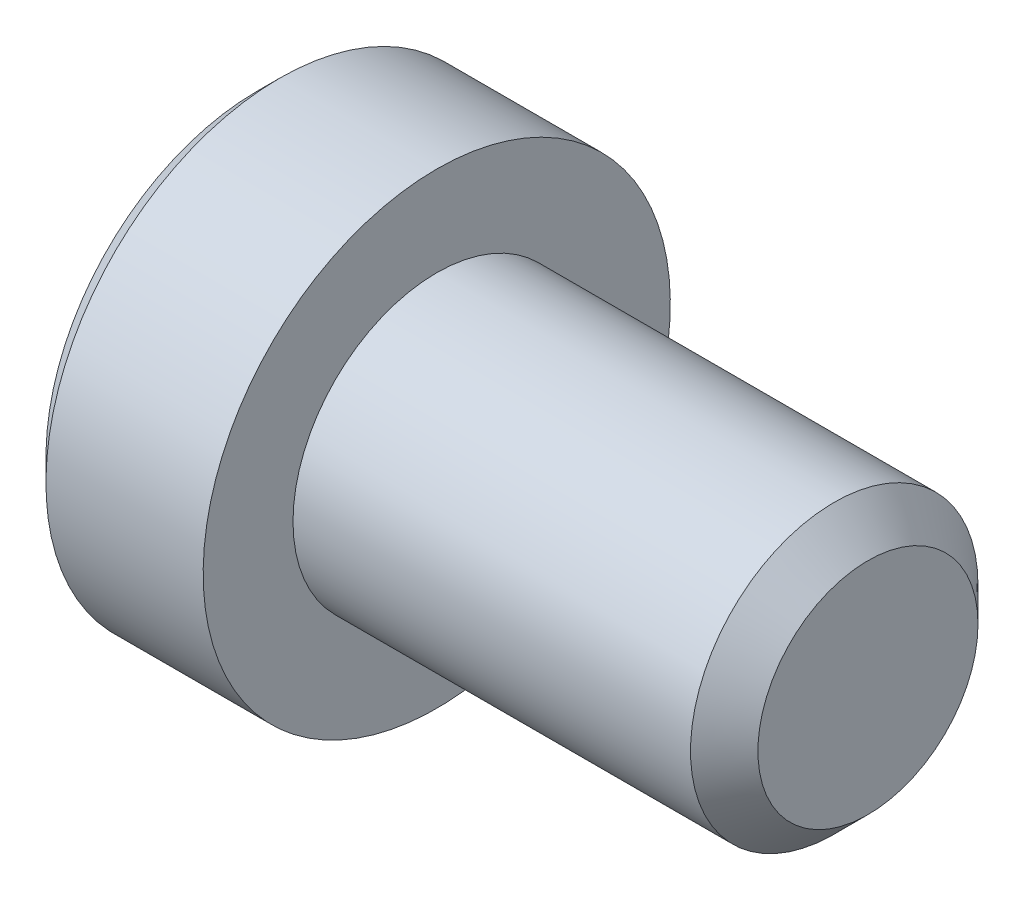
ISO-10303-21;
HEADER;
FILE_DESCRIPTION(('STEP AP214'),'2;1');
FILE_NAME('part.step','',(''),(''),'','','');
FILE_SCHEMA(('AUTOMOTIVE_DESIGN { 1 0 10303 214 1 1 1 1 }'));
ENDSEC;
DATA;
#1=APPLICATION_CONTEXT('core data for automotive mechanical design processes');
#2=APPLICATION_PROTOCOL_DEFINITION('international standard','automotive_design',2000,#1);
#3=PRODUCT_CONTEXT('',#1,'mechanical');
#4=PRODUCT('Part','Part','',(#3));
#5=PRODUCT_RELATED_PRODUCT_CATEGORY('part','',(#4));
#6=PRODUCT_DEFINITION_FORMATION('','',#4);
#7=PRODUCT_DEFINITION_CONTEXT('part definition',#1,'design');
#8=PRODUCT_DEFINITION('design','',#6,#7);
#9=PRODUCT_DEFINITION_SHAPE('','',#8);
#10=(LENGTH_UNIT() NAMED_UNIT(*) SI_UNIT(.MILLI.,.METRE.));
#11=(NAMED_UNIT(*) PLANE_ANGLE_UNIT() SI_UNIT($,.RADIAN.));
#12=(NAMED_UNIT(*) SI_UNIT($,.STERADIAN.) SOLID_ANGLE_UNIT());
#13=UNCERTAINTY_MEASURE_WITH_UNIT(LENGTH_MEASURE(1.E-05),#10,'distance_accuracy_value','');
#14=(GEOMETRIC_REPRESENTATION_CONTEXT(3) GLOBAL_UNCERTAINTY_ASSIGNED_CONTEXT((#13)) GLOBAL_UNIT_ASSIGNED_CONTEXT((#10,
#11,#12)) REPRESENTATION_CONTEXT('',''));
#15=CARTESIAN_POINT('',(0.,0.,0.));
#16=DIRECTION('',(0.,0.,1.));
#17=DIRECTION('',(1.,0.,0.));
#18=AXIS2_PLACEMENT_3D('',#15,#16,#17);
#19=CARTESIAN_POINT('',(-11.,5.87499999999999,0.));
#20=DIRECTION('',(-1.,0.,0.));
#21=DIRECTION('',(0.,-1.,0.));
#22=AXIS2_PLACEMENT_3D('',#19,#20,#21);
#23=PLANE('',#22);
#24=CARTESIAN_POINT('',(-11.,0.,0.));
#25=DIRECTION('',(-1.,0.,0.));
#26=DIRECTION('',(0.,-1.,0.));
#27=AXIS2_PLACEMENT_3D('',#24,#25,#26);
#28=CIRCLE('',#27,2.88675134594808);
#29=CARTESIAN_POINT('',(-11.,-2.88675134594805,-1.2793585635329E-13));
#30=VERTEX_POINT('',#29);
#31=CARTESIAN_POINT('',(-11.,-1.44337567297413,2.49999999999989));
#32=VERTEX_POINT('',#31);
#33=EDGE_CURVE('E142',#30,#32,#28,.T.);
#34=ORIENTED_EDGE('',*,*,#33,.F.);
#35=CARTESIAN_POINT('',(-11.,-1.44337567297406,-2.5));
#36=VERTEX_POINT('',#35);
#37=EDGE_CURVE('E141',#36,#30,#28,.T.);
#38=ORIENTED_EDGE('',*,*,#37,.F.);
#39=CARTESIAN_POINT('',(-11.,1.443375672974,-2.5));
#40=VERTEX_POINT('',#39);
#41=EDGE_CURVE('E111',#40,#36,#28,.T.);
#42=ORIENTED_EDGE('',*,*,#41,.F.);
#43=CARTESIAN_POINT('',(-11.,2.88675134594811,0.));
#44=VERTEX_POINT('',#43);
#45=EDGE_CURVE('E104',#44,#40,#28,.T.);
#46=ORIENTED_EDGE('',*,*,#45,.F.);
#47=CARTESIAN_POINT('',(-11.,1.443375672974,2.5));
#48=VERTEX_POINT('',#47);
#49=EDGE_CURVE('E65',#48,#44,#28,.T.);
#50=ORIENTED_EDGE('',*,*,#49,.F.);
#51=EDGE_CURVE('E72',#32,#48,#28,.T.);
#52=ORIENTED_EDGE('',*,*,#51,.F.);
#53=EDGE_LOOP('',(#34,#38,#42,#46,#50,#52));
#54=FACE_BOUND('',#53,.T.);
#55=CARTESIAN_POINT('',(-11.,0.,0.));
#56=DIRECTION('',(1.,0.,0.));
#57=DIRECTION('',(0.,1.,0.));
#58=AXIS2_PLACEMENT_3D('',#55,#56,#57);
#59=CIRCLE('',#58,5.87499999999999);
#60=CARTESIAN_POINT('',(-11.,5.87499999999999,0.));
#61=VERTEX_POINT('',#60);
#62=EDGE_CURVE('E231',#61,#61,#59,.T.);
#63=ORIENTED_EDGE('',*,*,#62,.F.);
#64=EDGE_LOOP('',(#63));
#65=FACE_BOUND('',#64,.T.);
#66=ADVANCED_FACE('F45',(#54,#65),#23,.T.);
#67=CARTESIAN_POINT('',(-6.,0.,0.));
#68=DIRECTION('',(1.,0.,0.));
#69=DIRECTION('',(0.,0.,-1.));
#70=AXIS2_PLACEMENT_3D('',#67,#68,#69);
#71=CYLINDRICAL_SURFACE('',#70,4.);
#72=CARTESIAN_POINT('',(5.0625,0.,0.));
#73=DIRECTION('',(1.,0.,0.));
#74=DIRECTION('',(0.,0.,-1.));
#75=AXIS2_PLACEMENT_3D('',#72,#73,#74);
#76=CIRCLE('',#75,4.);
#77=CARTESIAN_POINT('',(5.0625,0.,-4.));
#78=VERTEX_POINT('',#77);
#79=EDGE_CURVE('E59',#78,#78,#76,.F.);
#80=ORIENTED_EDGE('',*,*,#79,.T.);
#81=EDGE_LOOP('',(#80));
#82=FACE_BOUND('',#81,.T.);
#83=CARTESIAN_POINT('',(-6.,0.,0.));
#84=DIRECTION('',(1.,0.,0.));
#85=DIRECTION('',(0.,1.,0.));
#86=AXIS2_PLACEMENT_3D('',#83,#84,#85);
#87=CIRCLE('',#86,4.);
#88=CARTESIAN_POINT('',(-6.,3.99999999999999,0.));
#89=VERTEX_POINT('',#88);
#90=EDGE_CURVE('E224',#89,#89,#87,.F.);
#91=ORIENTED_EDGE('',*,*,#90,.F.);
#92=EDGE_LOOP('',(#91));
#93=FACE_BOUND('',#92,.T.);
#94=ADVANCED_FACE('F204',(#82,#93),#71,.T.);
#95=CARTESIAN_POINT('',(6.,0.,0.));
#96=DIRECTION('',(1.,0.,0.));
#97=DIRECTION('',(0.,0.,-1.));
#98=AXIS2_PLACEMENT_3D('',#95,#96,#97);
#99=PLANE('',#98);
#100=CARTESIAN_POINT('',(6.,0.,0.));
#101=DIRECTION('',(1.,0.,0.));
#102=DIRECTION('',(0.,0.,-1.));
#103=AXIS2_PLACEMENT_3D('',#100,#101,#102);
#104=CIRCLE('',#103,3.0625);
#105=CARTESIAN_POINT('',(6.,0.,-3.0625));
#106=VERTEX_POINT('',#105);
#107=EDGE_CURVE('E225',#106,#106,#104,.T.);
#108=ORIENTED_EDGE('',*,*,#107,.T.);
#109=EDGE_LOOP('',(#108));
#110=FACE_BOUND('',#109,.T.);
#111=ADVANCED_FACE('F212',(#110),#99,.T.);
#112=CARTESIAN_POINT('',(6.,0.,0.));
#113=DIRECTION('',(-1.,0.,0.));
#114=DIRECTION('',(0.,0.,1.));
#115=AXIS2_PLACEMENT_3D('',#112,#113,#114);
#116=CONICAL_SURFACE('',#115,3.0625,0.785398163397446);
#117=ORIENTED_EDGE('',*,*,#79,.F.);
#118=EDGE_LOOP('',(#117));
#119=FACE_BOUND('',#118,.T.);
#120=ORIENTED_EDGE('',*,*,#107,.F.);
#121=EDGE_LOOP('',(#120));
#122=FACE_BOUND('',#121,.T.);
#123=ADVANCED_FACE('F47',(#119,#122),#116,.T.);
#124=CARTESIAN_POINT('',(-6.,0.,0.));
#125=DIRECTION('',(1.,0.,0.));
#126=DIRECTION('',(0.,1.,0.));
#127=AXIS2_PLACEMENT_3D('',#124,#125,#126);
#128=CYLINDRICAL_SURFACE('',#127,6.5);
#129=CARTESIAN_POINT('',(-10.375,0.,0.));
#130=DIRECTION('',(1.,0.,0.));
#131=DIRECTION('',(0.,1.,0.));
#132=AXIS2_PLACEMENT_3D('',#129,#130,#131);
#133=CIRCLE('',#132,6.5);
#134=CARTESIAN_POINT('',(-10.375,6.5,0.));
#135=VERTEX_POINT('',#134);
#136=EDGE_CURVE('E226',#135,#135,#133,.T.);
#137=ORIENTED_EDGE('',*,*,#136,.T.);
#138=EDGE_LOOP('',(#137));
#139=FACE_BOUND('',#138,.T.);
#140=CARTESIAN_POINT('',(-6.00000000000001,0.,0.));
#141=DIRECTION('',(1.,0.,0.));
#142=DIRECTION('',(0.,1.,0.));
#143=AXIS2_PLACEMENT_3D('',#140,#141,#142);
#144=CIRCLE('',#143,6.5);
#145=CARTESIAN_POINT('',(-6.,6.5,0.));
#146=VERTEX_POINT('',#145);
#147=EDGE_CURVE('E236',#146,#146,#144,.T.);
#148=ORIENTED_EDGE('',*,*,#147,.F.);
#149=EDGE_LOOP('',(#148));
#150=FACE_BOUND('',#149,.T.);
#151=ADVANCED_FACE('F207',(#139,#150),#128,.T.);
#152=CARTESIAN_POINT('',(-10.375,0.,0.));
#153=DIRECTION('',(1.,0.,0.));
#154=DIRECTION('',(0.,1.,0.));
#155=AXIS2_PLACEMENT_3D('',#152,#153,#154);
#156=CONICAL_SURFACE('',#155,6.5,0.78539816339745);
#157=ORIENTED_EDGE('',*,*,#62,.T.);
#158=EDGE_LOOP('',(#157));
#159=FACE_BOUND('',#158,.T.);
#160=ORIENTED_EDGE('',*,*,#136,.F.);
#161=EDGE_LOOP('',(#160));
#162=FACE_BOUND('',#161,.T.);
#163=ADVANCED_FACE('F200',(#159,#162),#156,.T.);
#164=CARTESIAN_POINT('',(-6.,6.5,0.));
#165=DIRECTION('',(1.,0.,0.));
#166=DIRECTION('',(0.,1.,0.));
#167=AXIS2_PLACEMENT_3D('',#164,#165,#166);
#168=PLANE('',#167);
#169=ORIENTED_EDGE('',*,*,#90,.T.);
#170=EDGE_LOOP('',(#169));
#171=FACE_BOUND('',#170,.T.);
#172=ORIENTED_EDGE('',*,*,#147,.T.);
#173=EDGE_LOOP('',(#172));
#174=FACE_BOUND('',#173,.T.);
#175=ADVANCED_FACE('F164',(#171,#174),#168,.T.);
#176=CARTESIAN_POINT('',(-11.,0.,0.));
#177=DIRECTION('',(-1.,0.,0.));
#178=DIRECTION('',(0.,-1.,0.));
#179=AXIS2_PLACEMENT_3D('',#176,#177,#178);
#180=CONICAL_SURFACE('',#179,2.88675134594808,0.78539816339745);
#181=CARTESIAN_POINT('',(-11.9259641941009,-2.87868021658036,-2.5));
#182=CARTESIAN_POINT('',(-11.8730547697036,-2.80858751797061,-2.5));
#183=CARTESIAN_POINT('',(-11.8206567850984,-2.73810237423985,-2.5));
#184=CARTESIAN_POINT('',(-11.7171126837829,-2.59619238944627,-2.5));
#185=CARTESIAN_POINT('',(-11.6659668846335,-2.5247673169311,-2.5));
#186=CARTESIAN_POINT('',(-11.5647924982128,-2.38030019453244,-2.5));
#187=CARTESIAN_POINT('',(-11.5147756380036,-2.30724990391714,-2.5));
#188=CARTESIAN_POINT('',(-11.4166088441105,-2.15990937427124,-2.5));
#189=CARTESIAN_POINT('',(-11.3684587785286,-2.08561922337519,-2.5));
#190=CARTESIAN_POINT('',(-11.2717465596101,-1.93130274897281,-2.5));
#191=CARTESIAN_POINT('',(-11.2233189326825,-1.85119168522269,-2.5));
#192=CARTESIAN_POINT('',(-11.1296640598242,-1.68912282648628,-2.5));
#193=CARTESIAN_POINT('',(-11.0844363918026,-1.60716527694819,-2.5));
#194=CARTESIAN_POINT('',(-10.9981353747535,-1.4413766864921,-2.5));
#195=CARTESIAN_POINT('',(-10.9570503727365,-1.35755175941127,-2.5));
#196=CARTESIAN_POINT('',(-10.8799618661584,-1.1876157777155,-2.5));
#197=CARTESIAN_POINT('',(-10.8439560607765,-1.10150577935216,-2.5));
#198=CARTESIAN_POINT('',(-10.7809497443197,-0.933895283828147,-2.5));
#199=CARTESIAN_POINT('',(-10.7534577201783,-0.852581486760235,-2.5));
#200=CARTESIAN_POINT('',(-10.7049971144518,-0.687996185179675,-2.5));
#201=CARTESIAN_POINT('',(-10.684028982272,-0.604724546223788,-2.5));
#202=CARTESIAN_POINT('',(-10.6500599950409,-0.438105786660685,-2.5));
#203=CARTESIAN_POINT('',(-10.6369226334678,-0.354786957546946,-2.5));
#204=CARTESIAN_POINT('',(-10.6188701944141,-0.18725863845756,-2.5));
#205=CARTESIAN_POINT('',(-10.6139537035387,-0.103049304090214,-2.5));
#206=CARTESIAN_POINT('',(-10.6127080743668,0.0623819456391823,-2.5));
#207=CARTESIAN_POINT('',(-10.6160745516983,0.143601667517911,-2.5));
#208=CARTESIAN_POINT('',(-10.6305375923521,0.305344840293769,-2.5));
#209=CARTESIAN_POINT('',(-10.6416349066155,0.385868222782068,-2.5));
#210=CARTESIAN_POINT('',(-10.6711420785295,0.546999992215542,-2.5));
#211=CARTESIAN_POINT('',(-10.6896763767655,0.62758525788701,-2.5));
#212=CARTESIAN_POINT('',(-10.7330723319292,0.786991930695549,-2.5));
#213=CARTESIAN_POINT('',(-10.7579334594228,0.865813484821298,-2.5));
#214=CARTESIAN_POINT('',(-10.8455589110989,1.11399280185233,-2.5));
#215=CARTESIAN_POINT('',(-10.9183033352911,1.27984027488856,-2.5));
#216=CARTESIAN_POINT('',(-11.039542345017,1.52253018606747,-2.5));
#217=CARTESIAN_POINT('',(-11.0820714509333,1.60256472858069,-2.5));
#218=CARTESIAN_POINT('',(-11.1703965238313,1.76081489226358,-2.5));
#219=CARTESIAN_POINT('',(-11.216191902132,1.83903083784683,-2.5));
#220=CARTESIAN_POINT('',(-11.3080446783387,1.99000684544533,-2.5));
#221=CARTESIAN_POINT('',(-11.3539756350132,2.06284471965809,-2.5));
#222=CARTESIAN_POINT('',(-11.4477702449325,2.20727164667526,-2.5));
#223=CARTESIAN_POINT('',(-11.4956340445682,2.27886060429821,-2.5));
#224=CARTESIAN_POINT('',(-11.5925522358003,2.42037078473924,-2.5));
#225=CARTESIAN_POINT('',(-11.6415937977771,2.49030083096474,-2.5));
#226=CARTESIAN_POINT('',(-11.7409738346083,2.62920524911317,-2.5));
#227=CARTESIAN_POINT('',(-11.7913119491048,2.69817987855685,-2.5));
#228=CARTESIAN_POINT('',(-11.8421802970587,2.7667546328176,-2.5));
#229=B_SPLINE_CURVE_WITH_KNOTS('',3,(#181,#182,#183,#184,#185,#186,#187,#188,#189,#190,#191,
#192,#193,#194,#195,#196,#197,#198,#199,#200,#201,#202,#203,#204,#205,#206,#207,#208,#209,#210,
#211,#212,#213,#214,#215,#216,#217,#218,#219,#220,#221,#222,#223,#224,#225,#226,#227,#228),
.UNSPECIFIED.,.F.,.F.,(4,2,2,2,2,2,2,2,2,2,2,2,2,2,2,2,2,2,2,2,2,2,2,4),(0.,0.263465915021264,
0.52699796842355,0.79257194343078,1.05812712004023,1.33890112574003,1.61963802660794,
1.89956181259617,2.17935838614975,2.43663887722772,2.69393708742519,2.94660788207624,
3.19923523116723,3.44271854515947,3.68622551339971,3.93398926884441,4.18173229803094,
4.72334004843318,4.99521600373498,5.26704308198529,5.52534341645066,5.7836633510567,
6.03988492160255,6.29603603155376),.UNSPECIFIED.);
#230=EDGE_CURVE('E13',#36,#40,#229,.T.);
#231=ORIENTED_EDGE('',*,*,#230,.T.);
#232=ORIENTED_EDGE('',*,*,#41,.T.);
#233=EDGE_LOOP('',(#231,#232));
#234=FACE_BOUND('',#233,.T.);
#235=ADVANCED_FACE('F116',(#234),#180,.F.);
#236=CARTESIAN_POINT('',(-11.0001154769818,-2.88686681600197,0.000200000000000391));
#237=CARTESIAN_POINT('',(-10.9505407053548,-2.83725032818751,-0.085738277787765));
#238=CARTESIAN_POINT('',(-10.9038774813626,-2.7868041812811,-0.173113567275754));
#239=CARTESIAN_POINT('',(-10.8184381400384,-2.6839389026696,-0.351281456165591));
#240=CARTESIAN_POINT('',(-10.7797095624061,-2.6315099876986,-0.442091000681078));
#241=CARTESIAN_POINT('',(-10.7133667038978,-2.52578957716233,-0.625204123126926));
#242=CARTESIAN_POINT('',(-10.6855856685309,-2.47252500720903,-0.717461064529346));
#243=CARTESIAN_POINT('',(-10.6427831759107,-2.3648232334321,-0.904006008776294));
#244=CARTESIAN_POINT('',(-10.6277297666714,-2.31038931995912,-0.998288312566292));
#245=CARTESIAN_POINT('',(-10.6141477222096,-2.21657570605386,-1.16077825829186));
#246=CARTESIAN_POINT('',(-10.6121370992409,-2.17731721011877,-1.22877596788016));
#247=CARTESIAN_POINT('',(-10.6155241171876,-2.09886438835669,-1.36466024116923));
#248=CARTESIAN_POINT('',(-10.6209243552999,-2.05967008984861,-1.43254675755225));
#249=CARTESIAN_POINT('',(-10.6388257884025,-1.98165157555714,-1.56767878823612));
#250=CARTESIAN_POINT('',(-10.6513349270466,-1.94282782326096,-1.63492349975357));
#251=CARTESIAN_POINT('',(-10.6827675019558,-1.86585167424615,-1.76825010081821));
#252=CARTESIAN_POINT('',(-10.7016904464969,-1.82769922629677,-1.83433207909967));
#253=CARTESIAN_POINT('',(-10.7578673614083,-1.72997445583857,-2.00359634669128));
#254=CARTESIAN_POINT('',(-10.7993558315963,-1.6710080703923,-2.1057291222229));
#255=CARTESIAN_POINT('',(-10.8693940467232,-1.58430317001562,-2.25590641494051));
#256=CARTESIAN_POINT('',(-10.8940022521161,-1.55573003305807,-2.30539653988261));
#257=CARTESIAN_POINT('',(-10.9454618867153,-1.49911303110425,-2.40346006383885));
#258=CARTESIAN_POINT('',(-10.9723119387794,-1.47106885396706,-2.45203400349693));
#259=CARTESIAN_POINT('',(-11.0001154769818,-1.44326020292023,-2.5002));
#260=B_SPLINE_CURVE_WITH_KNOTS('',3,(#236,#237,#238,#239,#240,#241,#242,#243,#244,#245,#246,
#247,#248,#249,#250,#251,#252,#253,#254,#255,#256,#257,#258,#259),.UNSPECIFIED.,.F.,.F.,(4,2,2,
2,2,2,2,2,2,2,2,4),(0.,0.333012085133927,0.667964518301403,0.997597032043309,1.32639954393846,
1.5616942414717,1.79707142102084,2.03271213522172,2.26833478775652,2.64260240809534,
2.82922877818864,3.01574133749025),.UNSPECIFIED.);
#261=EDGE_CURVE('E144',#30,#36,#260,.T.);
#262=ORIENTED_EDGE('',*,*,#261,.T.);
#263=ORIENTED_EDGE('',*,*,#37,.T.);
#264=EDGE_LOOP('',(#262,#263));
#265=FACE_BOUND('',#264,.T.);
#266=ADVANCED_FACE('F163',(#265),#180,.F.);
#267=CARTESIAN_POINT('',(-11.0001154769818,-1.44326020292023,2.5002));
#268=CARTESIAN_POINT('',(-10.9505407053548,-1.49287669073469,2.41426172221224));
#269=CARTESIAN_POINT('',(-10.9038774813626,-1.5433228376411,2.32688643272425));
#270=CARTESIAN_POINT('',(-10.8184381400384,-1.64618811625259,2.14871854383441));
#271=CARTESIAN_POINT('',(-10.7797095624061,-1.69861703122359,2.05790899931893));
#272=CARTESIAN_POINT('',(-10.7133667038978,-1.80433744175985,1.87479587687308));
#273=CARTESIAN_POINT('',(-10.6855856685309,-1.85760201171315,1.78253893547066));
#274=CARTESIAN_POINT('',(-10.6427831759107,-1.96530378549009,1.59599399122372));
#275=CARTESIAN_POINT('',(-10.6277297666714,-2.01973769896306,1.50171168743372));
#276=CARTESIAN_POINT('',(-10.6141477222096,-2.11355131286832,1.33922174170816));
#277=CARTESIAN_POINT('',(-10.6121370992409,-2.15280980880341,1.27122403211986));
#278=CARTESIAN_POINT('',(-10.6155241171876,-2.23126263056549,1.13533975883079));
#279=CARTESIAN_POINT('',(-10.6209243552999,-2.27045692907357,1.06745324244777));
#280=CARTESIAN_POINT('',(-10.6388257884026,-2.34847544336504,0.9323212117639));
#281=CARTESIAN_POINT('',(-10.6513349270466,-2.38729919566122,0.865076500246445));
#282=CARTESIAN_POINT('',(-10.6827675019558,-2.46427534467603,0.731749899181805));
#283=CARTESIAN_POINT('',(-10.7016904464969,-2.50242779262541,0.665667920900347));
#284=CARTESIAN_POINT('',(-10.7578673614083,-2.60015256308361,0.496403653308739));
#285=CARTESIAN_POINT('',(-10.7993558315963,-2.65911894852988,0.39427087777711));
#286=CARTESIAN_POINT('',(-10.8693940467232,-2.74582384890657,0.244093585059493));
#287=CARTESIAN_POINT('',(-10.8940022521162,-2.77439698586412,0.194603460117392));
#288=CARTESIAN_POINT('',(-10.9454618867153,-2.83101398781794,0.0965399361611537));
#289=CARTESIAN_POINT('',(-10.9723119387794,-2.85905816495513,0.0479659965030721));
#290=CARTESIAN_POINT('',(-11.0001154769818,-2.88686681600197,-0.000200000000000158));
#291=B_SPLINE_CURVE_WITH_KNOTS('',3,(#267,#268,#269,#270,#271,#272,#273,#274,#275,#276,#277,
#278,#279,#280,#281,#282,#283,#284,#285,#286,#287,#288,#289,#290),.UNSPECIFIED.,.F.,.F.,(4,2,2,
2,2,2,2,2,2,2,2,4),(0.,0.33301208513392,0.66796451830139,0.99759703204329,1.32639954393843,
1.56169424147167,1.79707142102082,2.0327121352217,2.2683347877565,2.64260240809533,
2.82922877818863,3.01574133749025),.UNSPECIFIED.);
#292=EDGE_CURVE('E151',#32,#30,#291,.T.);
#293=ORIENTED_EDGE('',*,*,#292,.T.);
#294=ORIENTED_EDGE('',*,*,#33,.T.);
#295=EDGE_LOOP('',(#293,#294));
#296=FACE_BOUND('',#295,.T.);
#297=ADVANCED_FACE('F269',(#296),#180,.F.);
#298=CARTESIAN_POINT('',(-11.9259641937847,-2.87868021616153,2.5));
#299=CARTESIAN_POINT('',(-11.8730547693996,-2.80858751756353,2.5));
#300=CARTESIAN_POINT('',(-11.8206567848065,-2.73810237384456,2.5));
#301=CARTESIAN_POINT('',(-11.7171126835153,-2.59619238907467,2.5));
#302=CARTESIAN_POINT('',(-11.665966884378,-2.52476731657141,2.5));
#303=CARTESIAN_POINT('',(-11.5647924979815,-2.38030019419696,2.5));
#304=CARTESIAN_POINT('',(-11.5147756377845,-2.30724990359398,2.5));
#305=CARTESIAN_POINT('',(-11.4166088439156,-2.15990937397292,2.5));
#306=CARTESIAN_POINT('',(-11.3684587783456,-2.08561922308941,2.5));
#307=CARTESIAN_POINT('',(-11.271746559452,-1.93130274871407,2.5));
#308=CARTESIAN_POINT('',(-11.2233189325374,-1.85119168497848,2.5));
#309=CARTESIAN_POINT('',(-11.1296640597042,-1.68912282627166,2.5));
#310=CARTESIAN_POINT('',(-11.0844363916949,-1.60716527674862,2.5));
#311=CARTESIAN_POINT('',(-10.9981353746693,-1.44137668632317,2.5));
#312=CARTESIAN_POINT('',(-10.9570503726636,-1.35755175925794,2.5));
#313=CARTESIAN_POINT('',(-10.8799618661067,-1.18761577759418,2.5));
#314=CARTESIAN_POINT('',(-10.8439560607346,-1.10150577924727,2.5));
#315=CARTESIAN_POINT('',(-10.7809497442851,-0.933895283730353,2.5));
#316=CARTESIAN_POINT('',(-10.7534577201431,-0.852581486652392,2.5));
#317=CARTESIAN_POINT('',(-10.7049971144174,-0.687996185051405,2.5));
#318=CARTESIAN_POINT('',(-10.684028982239,-0.604724546085142,2.5));
#319=CARTESIAN_POINT('',(-10.6500599950131,-0.438105786501628,2.5));
#320=CARTESIAN_POINT('',(-10.6369226334437,-0.35478695737786,2.5));
#321=CARTESIAN_POINT('',(-10.6188701943996,-0.18725863826875,2.5));
#322=CARTESIAN_POINT('',(-10.6139537035302,-0.10304930389171,2.5));
#323=CARTESIAN_POINT('',(-10.6127080743719,0.0623819458555725,2.5));
#324=CARTESIAN_POINT('',(-10.6160745517109,0.143601667742518,2.5));
#325=CARTESIAN_POINT('',(-10.630537592381,0.305344840533988,2.5));
#326=CARTESIAN_POINT('',(-10.6416349066531,0.385868223029682,2.5));
#327=CARTESIAN_POINT('',(-10.6711420785854,0.546999992477755,2.5));
#328=CARTESIAN_POINT('',(-10.689676376831,0.627585258156404,2.5));
#329=CARTESIAN_POINT('',(-10.7330723320141,0.786991930978612,2.5));
#330=CARTESIAN_POINT('',(-10.7579334595175,0.865813485110849,2.5));
#331=CARTESIAN_POINT('',(-10.8455589112399,1.11399280220493,2.5));
#332=CARTESIAN_POINT('',(-10.9183033354747,1.27984027529459,2.5));
#333=CARTESIAN_POINT('',(-11.0395423452679,1.52253018655041,2.5));
#334=CARTESIAN_POINT('',(-11.0820714512072,1.60256472908881,2.5));
#335=CARTESIAN_POINT('',(-11.1703965241522,1.76081489282127,2.5));
#336=CARTESIAN_POINT('',(-11.2161919024768,1.83903083842889,2.5));
#337=CARTESIAN_POINT('',(-11.3080446787287,1.9900068460717,2.5));
#338=CARTESIAN_POINT('',(-11.3539756354245,2.06284472030447,2.5));
#339=CARTESIAN_POINT('',(-11.4477702453865,2.20727164736137,2.5));
#340=CARTESIAN_POINT('',(-11.4956340450437,2.27886060500404,2.5));
#341=CARTESIAN_POINT('',(-11.5925522363184,2.42037078548405,2.5));
#342=CARTESIAN_POINT('',(-11.6415937983162,2.4903008317288,2.5));
#343=CARTESIAN_POINT('',(-11.7409738351898,2.6292052499156,2.5));
#344=CARTESIAN_POINT('',(-11.7913119497074,2.69817987937842,2.5));
#345=CARTESIAN_POINT('',(-11.8421802976825,2.76675463365826,2.5));
#346=B_SPLINE_CURVE_WITH_KNOTS('',3,(#298,#299,#300,#301,#302,#303,#304,#305,#306,#307,#308,
#309,#310,#311,#312,#313,#314,#315,#316,#317,#318,#319,#320,#321,#322,#323,#324,#325,#326,#327,
#328,#329,#330,#331,#332,#333,#334,#335,#336,#337,#338,#339,#340,#341,#342,#343,#344,#345),
.UNSPECIFIED.,.F.,.F.,(4,2,2,2,2,2,2,2,2,2,2,2,2,2,2,2,2,2,2,2,2,2,2,4),(0.,0.263465914971116,
0.52699796832324,0.792571943279363,1.05812711983772,1.33890112548019,1.61963802629079,
1.89956181222217,2.17935838571898,2.43663887682601,2.69393708705249,2.94660788173136,
3.19923523085017,3.44271854486787,3.6862255131336,3.93398926860574,4.18173229781969,
4.72334004841909,4.99521600382015,5.26704308216967,5.52534341671994,5.78366335141087,
6.03988492204047,6.29603603207542),.UNSPECIFIED.);
#347=EDGE_CURVE('E171',#48,#32,#346,.F.);
#348=ORIENTED_EDGE('',*,*,#347,.T.);
#349=ORIENTED_EDGE('',*,*,#51,.T.);
#350=EDGE_LOOP('',(#348,#349));
#351=FACE_BOUND('',#350,.T.);
#352=ADVANCED_FACE('F285',(#351),#180,.F.);
#353=CARTESIAN_POINT('',(-11.0001154769818,2.88686681600197,-0.000199999999999645));
#354=CARTESIAN_POINT('',(-10.9505407053547,2.83725032818751,0.0857382777877645));
#355=CARTESIAN_POINT('',(-10.9038774813625,2.7868041812811,0.173113567275752));
#356=CARTESIAN_POINT('',(-10.8184381400383,2.6839389026696,0.351281456165586));
#357=CARTESIAN_POINT('',(-10.779709562406,2.6315099876986,0.442091000681071));
#358=CARTESIAN_POINT('',(-10.7133667038978,2.52578957716234,0.625204123126915));
#359=CARTESIAN_POINT('',(-10.6855856685309,2.47252500720904,0.717461064529333));
#360=CARTESIAN_POINT('',(-10.6427831759107,2.36482323343211,0.904006008776277));
#361=CARTESIAN_POINT('',(-10.6277297666714,2.31038931995913,0.998288312566274));
#362=CARTESIAN_POINT('',(-10.6141477222095,2.21657570605387,1.16077825829184));
#363=CARTESIAN_POINT('',(-10.6121370992408,2.17731721011879,1.22877596788014));
#364=CARTESIAN_POINT('',(-10.6155241171875,2.09886438835671,1.36466024116921));
#365=CARTESIAN_POINT('',(-10.6209243552998,2.05967008984863,1.43254675755223));
#366=CARTESIAN_POINT('',(-10.6388257884025,1.98165157555715,1.56767878823609));
#367=CARTESIAN_POINT('',(-10.6513349270465,1.94282782326097,1.63492349975355));
#368=CARTESIAN_POINT('',(-10.6827675019557,1.86585167424617,1.76825010081819));
#369=CARTESIAN_POINT('',(-10.7016904464968,1.82769922629678,1.83433207909964));
#370=CARTESIAN_POINT('',(-10.7578673614083,1.72997445583858,2.00359634669125));
#371=CARTESIAN_POINT('',(-10.7993558315962,1.67100807039231,2.10572912222288));
#372=CARTESIAN_POINT('',(-10.8693940467231,1.58430317001563,2.2559064149405));
#373=CARTESIAN_POINT('',(-10.8940022521161,1.55573003305808,2.30539653988261));
#374=CARTESIAN_POINT('',(-10.9454618867153,1.49911303110426,2.40346006383884));
#375=CARTESIAN_POINT('',(-10.9723119387794,1.47106885396706,2.45203400349693));
#376=CARTESIAN_POINT('',(-11.0001154769818,1.44326020292023,2.5002));
#377=B_SPLINE_CURVE_WITH_KNOTS('',3,(#353,#354,#355,#356,#357,#358,#359,#360,#361,#362,#363,
#364,#365,#366,#367,#368,#369,#370,#371,#372,#373,#374,#375,#376),.UNSPECIFIED.,.F.,.F.,(4,2,2,
2,2,2,2,2,2,2,2,4),(0.,0.333012085133921,0.667964518301389,0.997597032043288,1.32639954393843,
1.56169424147167,1.79707142102081,2.03271213522169,2.26833478775649,2.64260240809532,
2.82922877818863,3.01574133749025),.UNSPECIFIED.);
#378=EDGE_CURVE('E131',#44,#48,#377,.T.);
#379=ORIENTED_EDGE('',*,*,#378,.T.);
#380=ORIENTED_EDGE('',*,*,#49,.T.);
#381=EDGE_LOOP('',(#379,#380));
#382=FACE_BOUND('',#381,.T.);
#383=ADVANCED_FACE('F261',(#382),#180,.F.);
#384=CARTESIAN_POINT('',(-11.0001154769818,1.44326020292023,-2.5002));
#385=CARTESIAN_POINT('',(-10.9505407053548,1.49287669073469,-2.41426172221224));
#386=CARTESIAN_POINT('',(-10.9038774813625,1.5433228376411,-2.32688643272425));
#387=CARTESIAN_POINT('',(-10.8184381400383,1.64618811625259,-2.14871854383441));
#388=CARTESIAN_POINT('',(-10.779709562406,1.6986170312236,-2.05790899931892));
#389=CARTESIAN_POINT('',(-10.7133667038978,1.80433744175986,-1.87479587687307));
#390=CARTESIAN_POINT('',(-10.6855856685309,1.85760201171316,-1.78253893547065));
#391=CARTESIAN_POINT('',(-10.6427831759107,1.9653037854901,-1.59599399122371));
#392=CARTESIAN_POINT('',(-10.6277297666714,2.01973769896307,-1.50171168743371));
#393=CARTESIAN_POINT('',(-10.6141477222095,2.11355131286833,-1.33922174170814));
#394=CARTESIAN_POINT('',(-10.6121370992408,2.15280980880342,-1.27122403211984));
#395=CARTESIAN_POINT('',(-10.6155241171875,2.2312626305655,-1.13533975883077));
#396=CARTESIAN_POINT('',(-10.6209243552998,2.27045692907358,-1.06745324244775));
#397=CARTESIAN_POINT('',(-10.6388257884025,2.34847544336505,-0.932321211763885));
#398=CARTESIAN_POINT('',(-10.6513349270465,2.38729919566123,-0.865076500246431));
#399=CARTESIAN_POINT('',(-10.6827675019557,2.46427534467604,-0.731749899181793));
#400=CARTESIAN_POINT('',(-10.7016904464968,2.50242779262542,-0.665667920900336));
#401=CARTESIAN_POINT('',(-10.7578673614083,2.60015256308362,-0.49640365330873));
#402=CARTESIAN_POINT('',(-10.7993558315962,2.65911894852989,-0.394270877777103));
#403=CARTESIAN_POINT('',(-10.8693940467231,2.74582384890657,-0.244093585059489));
#404=CARTESIAN_POINT('',(-10.8940022521161,2.77439698586412,-0.194603460117389));
#405=CARTESIAN_POINT('',(-10.9454618867153,2.83101398781794,-0.0965399361611524));
#406=CARTESIAN_POINT('',(-10.9723119387794,2.85905816495513,-0.0479659965030717));
#407=CARTESIAN_POINT('',(-11.0001154769818,2.88686681600197,0.000200000000000272));
#408=B_SPLINE_CURVE_WITH_KNOTS('',3,(#384,#385,#386,#387,#388,#389,#390,#391,#392,#393,#394,
#395,#396,#397,#398,#399,#400,#401,#402,#403,#404,#405,#406,#407),.UNSPECIFIED.,.F.,.F.,(4,2,2,
2,2,2,2,2,2,2,2,4),(0.,0.333012085133929,0.667964518301405,0.997597032043311,1.32639954393846,
1.5616942414717,1.79707142102084,2.03271213522172,2.26833478775652,2.64260240809534,
2.82922877818864,3.01574133749025),.UNSPECIFIED.);
#409=EDGE_CURVE('E107',#40,#44,#408,.T.);
#410=ORIENTED_EDGE('',*,*,#409,.T.);
#411=ORIENTED_EDGE('',*,*,#45,.T.);
#412=EDGE_LOOP('',(#410,#411));
#413=FACE_BOUND('',#412,.T.);
#414=ADVANCED_FACE('F105',(#413),#180,.F.);
#415=CARTESIAN_POINT('',(-7.05,2.88675134594813,0.));
#416=DIRECTION('',(1.,0.,0.));
#417=DIRECTION('',(0.,0.,-1.));
#418=AXIS2_PLACEMENT_3D('',#415,#416,#417);
#419=PLANE('',#418);
#420=DIRECTION('',(0.,0.5,0.866025403784439));
#421=VECTOR('',#420,1.);
#422=CARTESIAN_POINT('',(-7.05,1.44337567297406,-2.5));
#423=LINE('',#422,#421);
#424=CARTESIAN_POINT('',(-7.05,1.44337567297406,-2.5));
#425=VERTEX_POINT('',#424);
#426=CARTESIAN_POINT('',(-7.05,2.88675134594813,0.));
#427=VERTEX_POINT('',#426);
#428=EDGE_CURVE('E130',#425,#427,#423,.T.);
#429=ORIENTED_EDGE('',*,*,#428,.F.);
#430=DIRECTION('',(0.,1.,0.));
#431=VECTOR('',#430,1.);
#432=CARTESIAN_POINT('',(-7.05,-1.44337567297406,-2.5));
#433=LINE('',#432,#431);
#434=CARTESIAN_POINT('',(-7.05,-1.44337567297406,-2.5));
#435=VERTEX_POINT('',#434);
#436=EDGE_CURVE('E135',#435,#425,#433,.T.);
#437=ORIENTED_EDGE('',*,*,#436,.F.);
#438=DIRECTION('',(0.,0.5,-0.866025403784439));
#439=VECTOR('',#438,1.);
#440=CARTESIAN_POINT('',(-7.05,-2.88675134594813,0.));
#441=LINE('',#440,#439);
#442=CARTESIAN_POINT('',(-7.05,-2.88675134594813,0.));
#443=VERTEX_POINT('',#442);
#444=EDGE_CURVE('E251',#443,#435,#441,.T.);
#445=ORIENTED_EDGE('',*,*,#444,.F.);
#446=DIRECTION('',(0.,-0.5,-0.866025403784439));
#447=VECTOR('',#446,1.);
#448=CARTESIAN_POINT('',(-7.05,-1.44337567297406,2.5));
#449=LINE('',#448,#447);
#450=CARTESIAN_POINT('',(-7.05,-1.44337567297406,2.5));
#451=VERTEX_POINT('',#450);
#452=EDGE_CURVE('E253',#451,#443,#449,.T.);
#453=ORIENTED_EDGE('',*,*,#452,.F.);
#454=DIRECTION('',(0.,-1.,0.));
#455=VECTOR('',#454,1.);
#456=CARTESIAN_POINT('',(-7.05,1.44337567297406,2.5));
#457=LINE('',#456,#455);
#458=CARTESIAN_POINT('',(-7.05,1.44337567297406,2.5));
#459=VERTEX_POINT('',#458);
#460=EDGE_CURVE('E255',#459,#451,#457,.T.);
#461=ORIENTED_EDGE('',*,*,#460,.F.);
#462=DIRECTION('',(0.,-0.5,0.866025403784439));
#463=VECTOR('',#462,1.);
#464=CARTESIAN_POINT('',(-7.05,2.88675134594813,0.));
#465=LINE('',#464,#463);
#466=EDGE_CURVE('E257',#427,#459,#465,.T.);
#467=ORIENTED_EDGE('',*,*,#466,.F.);
#468=EDGE_LOOP('',(#429,#437,#445,#453,#461,#467));
#469=FACE_BOUND('',#468,.T.);
#470=ADVANCED_FACE('F165',(#469),#419,.F.);
#471=CARTESIAN_POINT('',(-7.05,-1.44337567297406,-2.5));
#472=DIRECTION('',(0.,0.,1.));
#473=DIRECTION('',(0.,-1.,0.));
#474=AXIS2_PLACEMENT_3D('',#471,#472,#473);
#475=PLANE('',#474);
#476=ORIENTED_EDGE('',*,*,#230,.F.);
#477=DIRECTION('',(-1.,0.,0.));
#478=VECTOR('',#477,1.);
#479=CARTESIAN_POINT('',(-7.05,-1.44337567297406,-2.5));
#480=LINE('',#479,#478);
#481=EDGE_CURVE('E136',#435,#36,#480,.T.);
#482=ORIENTED_EDGE('',*,*,#481,.F.);
#483=ORIENTED_EDGE('',*,*,#436,.T.);
#484=DIRECTION('',(-1.,0.,0.));
#485=VECTOR('',#484,1.);
#486=CARTESIAN_POINT('',(-7.05,1.44337567297406,-2.5));
#487=LINE('',#486,#485);
#488=EDGE_CURVE('E126',#425,#40,#487,.T.);
#489=ORIENTED_EDGE('',*,*,#488,.T.);
#490=EDGE_LOOP('',(#476,#482,#483,#489));
#491=FACE_BOUND('',#490,.T.);
#492=ADVANCED_FACE('F133',(#491),#475,.T.);
#493=CARTESIAN_POINT('',(-7.05,-2.88675134594813,0.));
#494=DIRECTION('',(0.,0.866025403784439,0.5));
#495=DIRECTION('',(0.,-0.5,0.866025403784439));
#496=AXIS2_PLACEMENT_3D('',#493,#494,#495);
#497=PLANE('',#496);
#498=ORIENTED_EDGE('',*,*,#261,.F.);
#499=DIRECTION('',(-1.,0.,0.));
#500=VECTOR('',#499,1.);
#501=CARTESIAN_POINT('',(-7.05,-2.88675134594813,0.));
#502=LINE('',#501,#500);
#503=EDGE_CURVE('E246',#443,#30,#502,.T.);
#504=ORIENTED_EDGE('',*,*,#503,.F.);
#505=ORIENTED_EDGE('',*,*,#444,.T.);
#506=ORIENTED_EDGE('',*,*,#481,.T.);
#507=EDGE_LOOP('',(#498,#504,#505,#506));
#508=FACE_BOUND('',#507,.T.);
#509=ADVANCED_FACE('F158',(#508),#497,.T.);
#510=CARTESIAN_POINT('',(-7.05,-1.44337567297406,2.5));
#511=DIRECTION('',(0.,0.866025403784439,-0.5));
#512=DIRECTION('',(0.,0.5,0.866025403784439));
#513=AXIS2_PLACEMENT_3D('',#510,#511,#512);
#514=PLANE('',#513);
#515=ORIENTED_EDGE('',*,*,#292,.F.);
#516=DIRECTION('',(-1.,0.,0.));
#517=VECTOR('',#516,1.);
#518=CARTESIAN_POINT('',(-7.05,-1.44337567297406,2.5));
#519=LINE('',#518,#517);
#520=EDGE_CURVE('E243',#451,#32,#519,.T.);
#521=ORIENTED_EDGE('',*,*,#520,.F.);
#522=ORIENTED_EDGE('',*,*,#452,.T.);
#523=ORIENTED_EDGE('',*,*,#503,.T.);
#524=EDGE_LOOP('',(#515,#521,#522,#523));
#525=FACE_BOUND('',#524,.T.);
#526=ADVANCED_FACE('F275',(#525),#514,.T.);
#527=CARTESIAN_POINT('',(-7.05,1.44337567297406,2.5));
#528=DIRECTION('',(0.,0.,-1.));
#529=DIRECTION('',(-1.,0.,0.));
#530=AXIS2_PLACEMENT_3D('',#527,#528,#529);
#531=PLANE('',#530);
#532=ORIENTED_EDGE('',*,*,#347,.F.);
#533=DIRECTION('',(-1.,0.,0.));
#534=VECTOR('',#533,1.);
#535=CARTESIAN_POINT('',(-7.05,1.44337567297406,2.5));
#536=LINE('',#535,#534);
#537=EDGE_CURVE('E240',#459,#48,#536,.T.);
#538=ORIENTED_EDGE('',*,*,#537,.F.);
#539=ORIENTED_EDGE('',*,*,#460,.T.);
#540=ORIENTED_EDGE('',*,*,#520,.T.);
#541=EDGE_LOOP('',(#532,#538,#539,#540));
#542=FACE_BOUND('',#541,.T.);
#543=ADVANCED_FACE('F192',(#542),#531,.T.);
#544=CARTESIAN_POINT('',(-7.05,2.88675134594813,0.));
#545=DIRECTION('',(0.,-0.866025403784439,-0.5));
#546=DIRECTION('',(0.,0.5,-0.866025403784439));
#547=AXIS2_PLACEMENT_3D('',#544,#545,#546);
#548=PLANE('',#547);
#549=ORIENTED_EDGE('',*,*,#378,.F.);
#550=DIRECTION('',(-1.,0.,0.));
#551=VECTOR('',#550,1.);
#552=CARTESIAN_POINT('',(-7.05,2.88675134594813,0.));
#553=LINE('',#552,#551);
#554=EDGE_CURVE('E129',#427,#44,#553,.T.);
#555=ORIENTED_EDGE('',*,*,#554,.F.);
#556=ORIENTED_EDGE('',*,*,#466,.T.);
#557=ORIENTED_EDGE('',*,*,#537,.T.);
#558=EDGE_LOOP('',(#549,#555,#556,#557));
#559=FACE_BOUND('',#558,.T.);
#560=ADVANCED_FACE('F189',(#559),#548,.T.);
#561=CARTESIAN_POINT('',(-7.05,1.44337567297406,-2.5));
#562=DIRECTION('',(0.,-0.866025403784439,0.5));
#563=DIRECTION('',(0.,-0.5,-0.866025403784439));
#564=AXIS2_PLACEMENT_3D('',#561,#562,#563);
#565=PLANE('',#564);
#566=ORIENTED_EDGE('',*,*,#409,.F.);
#567=ORIENTED_EDGE('',*,*,#488,.F.);
#568=ORIENTED_EDGE('',*,*,#428,.T.);
#569=ORIENTED_EDGE('',*,*,#554,.T.);
#570=EDGE_LOOP('',(#566,#567,#568,#569));
#571=FACE_BOUND('',#570,.T.);
#572=ADVANCED_FACE('F124',(#571),#565,.T.);
#573=CLOSED_SHELL('',(#66,#94,#111,#123,#151,#163,#175,#235,#266,#297,#352,#383,#414,#470,#492,
#509,#526,#543,#560,#572));
#574=MANIFOLD_SOLID_BREP('B2',#573);
#575=ADVANCED_BREP_SHAPE_REPRESENTATION('',(#18,#574),#14);
#576=SHAPE_DEFINITION_REPRESENTATION(#9,#575);
ENDSEC;
END-ISO-10303-21;
